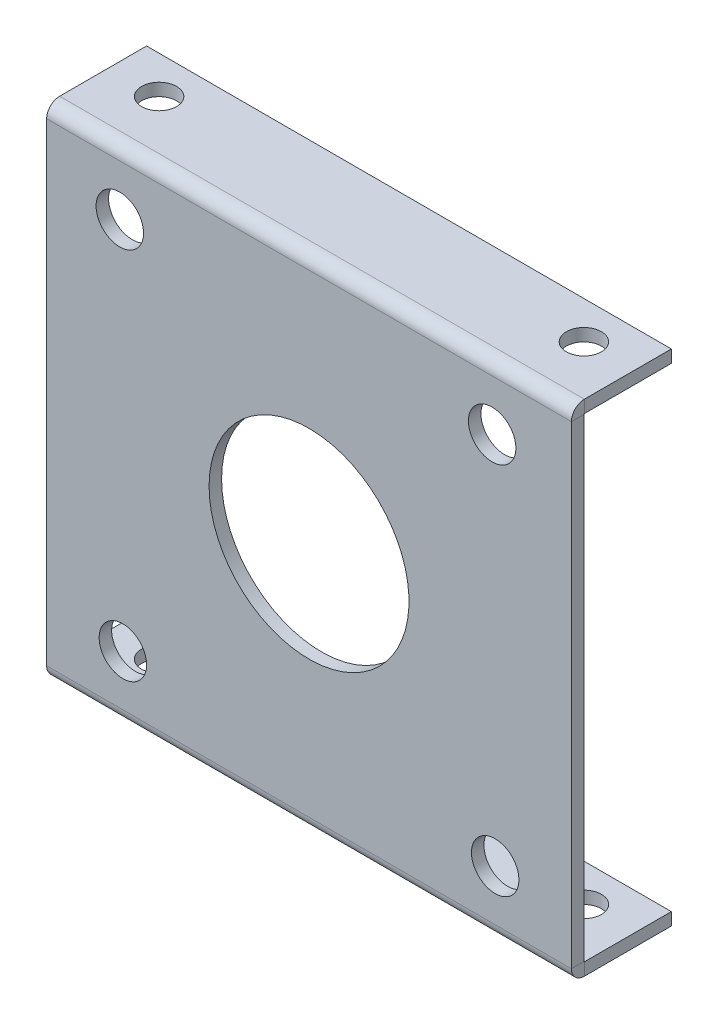
ISO-10303-21;
HEADER;
FILE_DESCRIPTION(('STEP AP214'),'2;1');
FILE_NAME('part.step','',(''),(''),'','','');
FILE_SCHEMA(('AUTOMOTIVE_DESIGN { 1 0 10303 214 1 1 1 1 }'));
ENDSEC;
DATA;
#1=APPLICATION_CONTEXT('core data for automotive mechanical design processes');
#2=APPLICATION_PROTOCOL_DEFINITION('international standard','automotive_design',2000,#1);
#3=PRODUCT_CONTEXT('',#1,'mechanical');
#4=PRODUCT('Part','Part','',(#3));
#5=PRODUCT_RELATED_PRODUCT_CATEGORY('part','',(#4));
#6=PRODUCT_DEFINITION_FORMATION('','',#4);
#7=PRODUCT_DEFINITION_CONTEXT('part definition',#1,'design');
#8=PRODUCT_DEFINITION('design','',#6,#7);
#9=PRODUCT_DEFINITION_SHAPE('','',#8);
#10=(LENGTH_UNIT() NAMED_UNIT(*) SI_UNIT(.MILLI.,.METRE.));
#11=(NAMED_UNIT(*) PLANE_ANGLE_UNIT() SI_UNIT($,.RADIAN.));
#12=(NAMED_UNIT(*) SI_UNIT($,.STERADIAN.) SOLID_ANGLE_UNIT());
#13=UNCERTAINTY_MEASURE_WITH_UNIT(LENGTH_MEASURE(1.E-05),#10,'distance_accuracy_value','');
#14=(GEOMETRIC_REPRESENTATION_CONTEXT(3) GLOBAL_UNCERTAINTY_ASSIGNED_CONTEXT((#13)) GLOBAL_UNIT_ASSIGNED_CONTEXT((#10,
#11,#12)) REPRESENTATION_CONTEXT('',''));
#15=CARTESIAN_POINT('',(0.,0.,0.));
#16=DIRECTION('',(0.,0.,1.));
#17=DIRECTION('',(1.,0.,0.));
#18=AXIS2_PLACEMENT_3D('',#15,#16,#17);
#19=CARTESIAN_POINT('',(0.,0.,-5.));
#20=DIRECTION('',(0.,0.,-1.));
#21=DIRECTION('',(-1.,0.,0.));
#22=AXIS2_PLACEMENT_3D('',#19,#20,#21);
#23=PLANE('',#22);
#24=CARTESIAN_POINT('',(74.5,-74.5,-5.));
#25=DIRECTION('',(0.,0.,-1.));
#26=DIRECTION('',(-1.,0.,0.));
#27=AXIS2_PLACEMENT_3D('',#24,#25,#26);
#28=CIRCLE('',#27,9.49999999999999);
#29=CARTESIAN_POINT('',(65.,-74.5,-5.));
#30=VERTEX_POINT('',#29);
#31=EDGE_CURVE('E297',#30,#30,#28,.T.);
#32=ORIENTED_EDGE('',*,*,#31,.F.);
#33=EDGE_LOOP('',(#32));
#34=FACE_BOUND('',#33,.T.);
#35=CARTESIAN_POINT('',(-74.5,-74.5,-5.));
#36=DIRECTION('',(0.,0.,-1.));
#37=DIRECTION('',(-1.,0.,0.));
#38=AXIS2_PLACEMENT_3D('',#35,#36,#37);
#39=CIRCLE('',#38,9.49999999999999);
#40=CARTESIAN_POINT('',(-84.,-74.5,-5.));
#41=VERTEX_POINT('',#40);
#42=EDGE_CURVE('E310',#41,#41,#39,.T.);
#43=ORIENTED_EDGE('',*,*,#42,.F.);
#44=EDGE_LOOP('',(#43));
#45=FACE_BOUND('',#44,.T.);
#46=CARTESIAN_POINT('',(-75.7170134817148,74.4950297096696,-5.));
#47=DIRECTION('',(0.,0.,-1.));
#48=DIRECTION('',(-1.,0.,0.));
#49=AXIS2_PLACEMENT_3D('',#46,#47,#48);
#50=CIRCLE('',#49,9.49999999999999);
#51=CARTESIAN_POINT('',(-85.2170134817148,74.4950297096696,-5.));
#52=VERTEX_POINT('',#51);
#53=EDGE_CURVE('E306',#52,#52,#50,.T.);
#54=ORIENTED_EDGE('',*,*,#53,.F.);
#55=EDGE_LOOP('',(#54));
#56=FACE_BOUND('',#55,.T.);
#57=CARTESIAN_POINT('',(73.2829865182852,74.4950297096696,-5.));
#58=DIRECTION('',(0.,0.,-1.));
#59=DIRECTION('',(-1.,0.,0.));
#60=AXIS2_PLACEMENT_3D('',#57,#58,#59);
#61=CIRCLE('',#60,9.49999999999999);
#62=CARTESIAN_POINT('',(63.7829865182852,74.4950297096696,-5.));
#63=VERTEX_POINT('',#62);
#64=EDGE_CURVE('E301',#63,#63,#61,.T.);
#65=ORIENTED_EDGE('',*,*,#64,.F.);
#66=EDGE_LOOP('',(#65));
#67=FACE_BOUND('',#66,.T.);
#68=CARTESIAN_POINT('',(0.,0.,-5.));
#69=DIRECTION('',(0.,0.,-1.));
#70=DIRECTION('',(-1.,0.,0.));
#71=AXIS2_PLACEMENT_3D('',#68,#69,#70);
#72=CIRCLE('',#71,40.);
#73=CARTESIAN_POINT('',(-40.,0.,-5.));
#74=VERTEX_POINT('',#73);
#75=EDGE_CURVE('E213',#74,#74,#72,.T.);
#76=ORIENTED_EDGE('',*,*,#75,.F.);
#77=EDGE_LOOP('',(#76));
#78=FACE_BOUND('',#77,.T.);
#79=DIRECTION('',(0.,1.,0.));
#80=VECTOR('',#79,1.);
#81=CARTESIAN_POINT('',(105.,-100.,-5.));
#82=LINE('',#81,#80);
#83=CARTESIAN_POINT('',(105.,-94.8,-5.00000000000001));
#84=VERTEX_POINT('',#83);
#85=CARTESIAN_POINT('',(105.,94.8,-5.));
#86=VERTEX_POINT('',#85);
#87=EDGE_CURVE('E88',#84,#86,#82,.T.);
#88=ORIENTED_EDGE('',*,*,#87,.F.);
#89=DIRECTION('',(-1.,0.,0.));
#90=VECTOR('',#89,1.);
#91=CARTESIAN_POINT('',(-105.,-94.8,-5.00000000000001));
#92=LINE('',#91,#90);
#93=CARTESIAN_POINT('',(-105.,-94.8,-5.00000000000001));
#94=VERTEX_POINT('',#93);
#95=EDGE_CURVE('E226',#94,#84,#92,.F.);
#96=ORIENTED_EDGE('',*,*,#95,.F.);
#97=DIRECTION('',(0.,-1.,0.));
#98=VECTOR('',#97,1.);
#99=CARTESIAN_POINT('',(-105.,-100.,-5.));
#100=LINE('',#99,#98);
#101=CARTESIAN_POINT('',(-105.,94.8,-5.));
#102=VERTEX_POINT('',#101);
#103=EDGE_CURVE('E13',#102,#94,#100,.T.);
#104=ORIENTED_EDGE('',*,*,#103,.F.);
#105=DIRECTION('',(1.,0.,0.));
#106=VECTOR('',#105,1.);
#107=CARTESIAN_POINT('',(105.,94.8,-5.00000000000001));
#108=LINE('',#107,#106);
#109=EDGE_CURVE('E282',#86,#102,#108,.F.);
#110=ORIENTED_EDGE('',*,*,#109,.F.);
#111=EDGE_LOOP('',(#88,#96,#104,#110));
#112=FACE_BOUND('',#111,.T.);
#113=ADVANCED_FACE('F79',(#34,#45,#56,#67,#78,#112),#23,.T.);
#114=CARTESIAN_POINT('',(0.,0.,0.));
#115=DIRECTION('',(0.,0.,-1.));
#116=DIRECTION('',(-1.,0.,0.));
#117=AXIS2_PLACEMENT_3D('',#114,#115,#116);
#118=PLANE('',#117);
#119=CARTESIAN_POINT('',(74.5,-74.5,0.));
#120=DIRECTION('',(0.,0.,-1.));
#121=DIRECTION('',(-1.,0.,0.));
#122=AXIS2_PLACEMENT_3D('',#119,#120,#121);
#123=CIRCLE('',#122,9.49999999999999);
#124=CARTESIAN_POINT('',(65.,-74.5,0.));
#125=VERTEX_POINT('',#124);
#126=EDGE_CURVE('E311',#125,#125,#123,.T.);
#127=ORIENTED_EDGE('',*,*,#126,.T.);
#128=EDGE_LOOP('',(#127));
#129=FACE_BOUND('',#128,.T.);
#130=CARTESIAN_POINT('',(-74.5,-74.5,0.));
#131=DIRECTION('',(0.,0.,-1.));
#132=DIRECTION('',(-1.,0.,0.));
#133=AXIS2_PLACEMENT_3D('',#130,#131,#132);
#134=CIRCLE('',#133,9.49999999999999);
#135=CARTESIAN_POINT('',(-84.,-74.5,0.));
#136=VERTEX_POINT('',#135);
#137=EDGE_CURVE('E307',#136,#136,#134,.T.);
#138=ORIENTED_EDGE('',*,*,#137,.T.);
#139=EDGE_LOOP('',(#138));
#140=FACE_BOUND('',#139,.T.);
#141=CARTESIAN_POINT('',(-75.7170134817148,74.4950297096696,0.));
#142=DIRECTION('',(0.,0.,-1.));
#143=DIRECTION('',(-1.,0.,0.));
#144=AXIS2_PLACEMENT_3D('',#141,#142,#143);
#145=CIRCLE('',#144,9.49999999999999);
#146=CARTESIAN_POINT('',(-85.2170134817148,74.4950297096696,0.));
#147=VERTEX_POINT('',#146);
#148=EDGE_CURVE('E303',#147,#147,#145,.T.);
#149=ORIENTED_EDGE('',*,*,#148,.T.);
#150=EDGE_LOOP('',(#149));
#151=FACE_BOUND('',#150,.T.);
#152=CARTESIAN_POINT('',(73.2829865182852,74.4950297096696,0.));
#153=DIRECTION('',(0.,0.,-1.));
#154=DIRECTION('',(-1.,0.,0.));
#155=AXIS2_PLACEMENT_3D('',#152,#153,#154);
#156=CIRCLE('',#155,9.49999999999999);
#157=CARTESIAN_POINT('',(63.7829865182852,74.4950297096696,0.));
#158=VERTEX_POINT('',#157);
#159=EDGE_CURVE('E298',#158,#158,#156,.T.);
#160=ORIENTED_EDGE('',*,*,#159,.T.);
#161=EDGE_LOOP('',(#160));
#162=FACE_BOUND('',#161,.T.);
#163=CARTESIAN_POINT('',(0.,0.,0.));
#164=DIRECTION('',(0.,0.,-1.));
#165=DIRECTION('',(-1.,0.,0.));
#166=AXIS2_PLACEMENT_3D('',#163,#164,#165);
#167=CIRCLE('',#166,40.);
#168=CARTESIAN_POINT('',(-40.,0.,0.));
#169=VERTEX_POINT('',#168);
#170=EDGE_CURVE('E294',#169,#169,#167,.T.);
#171=ORIENTED_EDGE('',*,*,#170,.T.);
#172=EDGE_LOOP('',(#171));
#173=FACE_BOUND('',#172,.T.);
#174=DIRECTION('',(-1.,0.,0.));
#175=VECTOR('',#174,1.);
#176=CARTESIAN_POINT('',(-105.,-94.8,0.));
#177=LINE('',#176,#175);
#178=CARTESIAN_POINT('',(-105.,-94.8,0.));
#179=VERTEX_POINT('',#178);
#180=CARTESIAN_POINT('',(105.,-94.8,0.));
#181=VERTEX_POINT('',#180);
#182=EDGE_CURVE('E214',#179,#181,#177,.F.);
#183=ORIENTED_EDGE('',*,*,#182,.T.);
#184=DIRECTION('',(0.,1.,0.));
#185=VECTOR('',#184,1.);
#186=CARTESIAN_POINT('',(105.,-100.,0.));
#187=LINE('',#186,#185);
#188=CARTESIAN_POINT('',(105.,94.8,0.));
#189=VERTEX_POINT('',#188);
#190=EDGE_CURVE('E288',#181,#189,#187,.T.);
#191=ORIENTED_EDGE('',*,*,#190,.T.);
#192=DIRECTION('',(1.,0.,0.));
#193=VECTOR('',#192,1.);
#194=CARTESIAN_POINT('',(105.,94.8,0.));
#195=LINE('',#194,#193);
#196=CARTESIAN_POINT('',(-105.,94.8,0.));
#197=VERTEX_POINT('',#196);
#198=EDGE_CURVE('E270',#189,#197,#195,.F.);
#199=ORIENTED_EDGE('',*,*,#198,.T.);
#200=DIRECTION('',(0.,-1.,0.));
#201=VECTOR('',#200,1.);
#202=CARTESIAN_POINT('',(-105.,-100.,0.));
#203=LINE('',#202,#201);
#204=EDGE_CURVE('E290',#197,#179,#203,.T.);
#205=ORIENTED_EDGE('',*,*,#204,.T.);
#206=EDGE_LOOP('',(#183,#191,#199,#205));
#207=FACE_BOUND('',#206,.T.);
#208=ADVANCED_FACE('F372',(#129,#140,#151,#162,#173,#207),#118,.F.);
#209=CARTESIAN_POINT('',(-105.,-100.,-5.));
#210=DIRECTION('',(-1.,0.,0.));
#211=DIRECTION('',(0.,0.,1.));
#212=AXIS2_PLACEMENT_3D('',#209,#210,#211);
#213=PLANE('',#212);
#214=ORIENTED_EDGE('',*,*,#103,.T.);
#215=DIRECTION('',(0.,0.,1.));
#216=VECTOR('',#215,1.);
#217=CARTESIAN_POINT('',(-105.,-94.8,-5.00000000000001));
#218=LINE('',#217,#216);
#219=EDGE_CURVE('E220',#94,#179,#218,.T.);
#220=ORIENTED_EDGE('',*,*,#219,.T.);
#221=ORIENTED_EDGE('',*,*,#204,.F.);
#222=DIRECTION('',(0.,0.,1.));
#223=VECTOR('',#222,1.);
#224=CARTESIAN_POINT('',(-105.,94.8,-5.00000000000001));
#225=LINE('',#224,#223);
#226=EDGE_CURVE('E95',#102,#197,#225,.T.);
#227=ORIENTED_EDGE('',*,*,#226,.F.);
#228=EDGE_LOOP('',(#214,#220,#221,#227));
#229=FACE_BOUND('',#228,.T.);
#230=ADVANCED_FACE('F378',(#229),#213,.T.);
#231=CARTESIAN_POINT('',(105.,-100.,-5.));
#232=DIRECTION('',(1.,0.,0.));
#233=DIRECTION('',(0.,0.,-1.));
#234=AXIS2_PLACEMENT_3D('',#231,#232,#233);
#235=PLANE('',#234);
#236=DIRECTION('',(0.,0.,1.));
#237=VECTOR('',#236,1.);
#238=CARTESIAN_POINT('',(105.,-94.8,-5.00000000000001));
#239=LINE('',#238,#237);
#240=EDGE_CURVE('E232',#84,#181,#239,.T.);
#241=ORIENTED_EDGE('',*,*,#240,.F.);
#242=ORIENTED_EDGE('',*,*,#87,.T.);
#243=DIRECTION('',(0.,0.,1.));
#244=VECTOR('',#243,1.);
#245=CARTESIAN_POINT('',(105.,94.8,-5.00000000000001));
#246=LINE('',#245,#244);
#247=EDGE_CURVE('E276',#86,#189,#246,.T.);
#248=ORIENTED_EDGE('',*,*,#247,.T.);
#249=ORIENTED_EDGE('',*,*,#190,.F.);
#250=EDGE_LOOP('',(#241,#242,#248,#249));
#251=FACE_BOUND('',#250,.T.);
#252=ADVANCED_FACE('F81',(#251),#235,.T.);
#253=CARTESIAN_POINT('',(-105.,94.8,-5.20000000000001));
#254=DIRECTION('',(-1.,0.,0.));
#255=DIRECTION('',(0.,0.,1.));
#256=AXIS2_PLACEMENT_3D('',#253,#254,#255);
#257=PLANE('',#256);
#258=DIRECTION('',(0.,1.,0.));
#259=VECTOR('',#258,1.);
#260=CARTESIAN_POINT('',(-105.,100.,-5.19999999999999));
#261=LINE('',#260,#259);
#262=CARTESIAN_POINT('',(-105.,95.,-5.20000000000001));
#263=VERTEX_POINT('',#262);
#264=CARTESIAN_POINT('',(-105.,100.,-5.19999999999999));
#265=VERTEX_POINT('',#264);
#266=EDGE_CURVE('E235',#263,#265,#261,.T.);
#267=ORIENTED_EDGE('',*,*,#266,.F.);
#268=CARTESIAN_POINT('',(-105.,94.8,-5.20000000000001));
#269=DIRECTION('',(1.,0.,0.));
#270=DIRECTION('',(0.,0.,-1.));
#271=AXIS2_PLACEMENT_3D('',#268,#269,#270);
#272=CIRCLE('',#271,0.200000000000006);
#273=EDGE_CURVE('E279',#102,#263,#272,.F.);
#274=ORIENTED_EDGE('',*,*,#273,.F.);
#275=ORIENTED_EDGE('',*,*,#226,.T.);
#276=CARTESIAN_POINT('',(-105.,94.8,-5.20000000000001));
#277=DIRECTION('',(1.,0.,0.));
#278=DIRECTION('',(0.,0.,-1.));
#279=AXIS2_PLACEMENT_3D('',#276,#277,#278);
#280=CIRCLE('',#279,5.20000000000001);
#281=EDGE_CURVE('E272',#197,#265,#280,.F.);
#282=ORIENTED_EDGE('',*,*,#281,.T.);
#283=EDGE_LOOP('',(#267,#274,#275,#282));
#284=FACE_BOUND('',#283,.T.);
#285=ADVANCED_FACE('F390',(#284),#257,.T.);
#286=CARTESIAN_POINT('',(105.,94.8,-5.20000000000001));
#287=DIRECTION('',(-1.,0.,0.));
#288=DIRECTION('',(0.,0.,1.));
#289=AXIS2_PLACEMENT_3D('',#286,#287,#288);
#290=PLANE('',#289);
#291=CARTESIAN_POINT('',(105.,94.8,-5.20000000000001));
#292=DIRECTION('',(1.,0.,0.));
#293=DIRECTION('',(0.,0.,-1.));
#294=AXIS2_PLACEMENT_3D('',#291,#292,#293);
#295=CIRCLE('',#294,0.200000000000006);
#296=CARTESIAN_POINT('',(105.,95.,-5.20000000000001));
#297=VERTEX_POINT('',#296);
#298=EDGE_CURVE('E240',#297,#86,#295,.T.);
#299=ORIENTED_EDGE('',*,*,#298,.F.);
#300=DIRECTION('',(0.,1.,0.));
#301=VECTOR('',#300,1.);
#302=CARTESIAN_POINT('',(105.,95.,-5.20000000000001));
#303=LINE('',#302,#301);
#304=CARTESIAN_POINT('',(105.,100.,-5.19999999999999));
#305=VERTEX_POINT('',#304);
#306=EDGE_CURVE('E263',#297,#305,#303,.T.);
#307=ORIENTED_EDGE('',*,*,#306,.T.);
#308=CARTESIAN_POINT('',(105.,94.8,-5.20000000000001));
#309=DIRECTION('',(1.,0.,0.));
#310=DIRECTION('',(0.,0.,-1.));
#311=AXIS2_PLACEMENT_3D('',#308,#309,#310);
#312=CIRCLE('',#311,5.20000000000001);
#313=EDGE_CURVE('E273',#305,#189,#312,.T.);
#314=ORIENTED_EDGE('',*,*,#313,.T.);
#315=ORIENTED_EDGE('',*,*,#247,.F.);
#316=EDGE_LOOP('',(#299,#307,#314,#315));
#317=FACE_BOUND('',#316,.T.);
#318=ADVANCED_FACE('F384',(#317),#290,.F.);
#319=CARTESIAN_POINT('',(105.,94.8,-5.20000000000001));
#320=DIRECTION('',(1.,0.,0.));
#321=DIRECTION('',(0.,1.,0.));
#322=AXIS2_PLACEMENT_3D('',#319,#320,#321);
#323=CYLINDRICAL_SURFACE('',#322,5.20000000000001);
#324=ORIENTED_EDGE('',*,*,#198,.F.);
#325=ORIENTED_EDGE('',*,*,#313,.F.);
#326=DIRECTION('',(1.,0.,0.));
#327=VECTOR('',#326,1.);
#328=CARTESIAN_POINT('',(0.,100.,-5.19999999999999));
#329=LINE('',#328,#327);
#330=EDGE_CURVE('E260',#265,#305,#329,.T.);
#331=ORIENTED_EDGE('',*,*,#330,.F.);
#332=ORIENTED_EDGE('',*,*,#281,.F.);
#333=EDGE_LOOP('',(#324,#325,#331,#332));
#334=FACE_BOUND('',#333,.T.);
#335=ADVANCED_FACE('F423',(#334),#323,.T.);
#336=CARTESIAN_POINT('',(105.,94.8,-5.20000000000001));
#337=DIRECTION('',(1.,0.,0.));
#338=DIRECTION('',(0.,1.,0.));
#339=AXIS2_PLACEMENT_3D('',#336,#337,#338);
#340=CYLINDRICAL_SURFACE('',#339,0.200000000000006);
#341=ORIENTED_EDGE('',*,*,#109,.T.);
#342=ORIENTED_EDGE('',*,*,#273,.T.);
#343=DIRECTION('',(-1.,0.,0.));
#344=VECTOR('',#343,1.);
#345=CARTESIAN_POINT('',(-105.,95.,-5.20000000000001));
#346=LINE('',#345,#344);
#347=EDGE_CURVE('E266',#263,#297,#346,.F.);
#348=ORIENTED_EDGE('',*,*,#347,.T.);
#349=ORIENTED_EDGE('',*,*,#298,.T.);
#350=EDGE_LOOP('',(#341,#342,#348,#349));
#351=FACE_BOUND('',#350,.T.);
#352=ADVANCED_FACE('F396',(#351),#340,.F.);
#353=CARTESIAN_POINT('',(105.,100.,-4.99999999999998));
#354=DIRECTION('',(1.,0.,0.));
#355=DIRECTION('',(0.,0.,-1.));
#356=AXIS2_PLACEMENT_3D('',#353,#354,#355);
#357=PLANE('',#356);
#358=DIRECTION('',(0.,0.,1.));
#359=VECTOR('',#358,1.);
#360=CARTESIAN_POINT('',(105.,100.,-4.99999999999998));
#361=LINE('',#360,#359);
#362=CARTESIAN_POINT('',(105.,100.,-40.));
#363=VERTEX_POINT('',#362);
#364=EDGE_CURVE('E244',#363,#305,#361,.T.);
#365=ORIENTED_EDGE('',*,*,#364,.T.);
#366=ORIENTED_EDGE('',*,*,#306,.F.);
#367=DIRECTION('',(0.,0.,-1.));
#368=VECTOR('',#367,1.);
#369=CARTESIAN_POINT('',(105.,95.,3.56857400772372E-13));
#370=LINE('',#369,#368);
#371=CARTESIAN_POINT('',(105.,95.0000000000001,-40.));
#372=VERTEX_POINT('',#371);
#373=EDGE_CURVE('E252',#372,#297,#370,.F.);
#374=ORIENTED_EDGE('',*,*,#373,.F.);
#375=DIRECTION('',(0.,-1.,0.));
#376=VECTOR('',#375,1.);
#377=CARTESIAN_POINT('',(105.,100.,-40.));
#378=LINE('',#377,#376);
#379=EDGE_CURVE('E238',#363,#372,#378,.T.);
#380=ORIENTED_EDGE('',*,*,#379,.F.);
#381=EDGE_LOOP('',(#365,#366,#374,#380));
#382=FACE_BOUND('',#381,.T.);
#383=ADVANCED_FACE('F418',(#382),#357,.T.);
#384=CARTESIAN_POINT('',(-105.,100.,-40.));
#385=DIRECTION('',(-1.,0.,0.));
#386=DIRECTION('',(0.,0.,1.));
#387=AXIS2_PLACEMENT_3D('',#384,#385,#386);
#388=PLANE('',#387);
#389=DIRECTION('',(0.,0.,1.));
#390=VECTOR('',#389,1.);
#391=CARTESIAN_POINT('',(-105.,95.,3.56857400772372E-13));
#392=LINE('',#391,#390);
#393=CARTESIAN_POINT('',(-105.,95.0000000000001,-40.));
#394=VERTEX_POINT('',#393);
#395=EDGE_CURVE('E258',#263,#394,#392,.F.);
#396=ORIENTED_EDGE('',*,*,#395,.F.);
#397=ORIENTED_EDGE('',*,*,#266,.T.);
#398=DIRECTION('',(0.,0.,-1.));
#399=VECTOR('',#398,1.);
#400=CARTESIAN_POINT('',(-105.,100.,-40.));
#401=LINE('',#400,#399);
#402=CARTESIAN_POINT('',(-105.,100.,-40.));
#403=VERTEX_POINT('',#402);
#404=EDGE_CURVE('E250',#265,#403,#401,.T.);
#405=ORIENTED_EDGE('',*,*,#404,.T.);
#406=DIRECTION('',(0.,-1.,0.));
#407=VECTOR('',#406,1.);
#408=CARTESIAN_POINT('',(-105.,100.,-40.));
#409=LINE('',#408,#407);
#410=EDGE_CURVE('E241',#403,#394,#409,.T.);
#411=ORIENTED_EDGE('',*,*,#410,.T.);
#412=EDGE_LOOP('',(#396,#397,#405,#411));
#413=FACE_BOUND('',#412,.T.);
#414=ADVANCED_FACE('F404',(#413),#388,.T.);
#415=CARTESIAN_POINT('',(0.,100.,3.74314807466587E-13));
#416=DIRECTION('',(0.,1.,0.));
#417=DIRECTION('',(0.,0.,1.));
#418=AXIS2_PLACEMENT_3D('',#415,#416,#417);
#419=PLANE('',#418);
#420=CARTESIAN_POINT('',(-85.,100.,-25.0000000000007));
#421=DIRECTION('',(0.,-1.,0.));
#422=DIRECTION('',(0.,0.,-1.));
#423=AXIS2_PLACEMENT_3D('',#420,#421,#422);
#424=CIRCLE('',#423,7.);
#425=CARTESIAN_POINT('',(-85.,100.,-32.0000000000007));
#426=VERTEX_POINT('',#425);
#427=EDGE_CURVE('E316',#426,#426,#424,.T.);
#428=ORIENTED_EDGE('',*,*,#427,.T.);
#429=EDGE_LOOP('',(#428));
#430=FACE_BOUND('',#429,.T.);
#431=CARTESIAN_POINT('',(85.,100.,-25.0000000000007));
#432=DIRECTION('',(0.,-1.,0.));
#433=DIRECTION('',(0.,0.,-1.));
#434=AXIS2_PLACEMENT_3D('',#431,#432,#433);
#435=CIRCLE('',#434,7.);
#436=CARTESIAN_POINT('',(85.,100.,-32.0000000000007));
#437=VERTEX_POINT('',#436);
#438=EDGE_CURVE('E323',#437,#437,#435,.T.);
#439=ORIENTED_EDGE('',*,*,#438,.T.);
#440=EDGE_LOOP('',(#439));
#441=FACE_BOUND('',#440,.T.);
#442=ORIENTED_EDGE('',*,*,#404,.F.);
#443=ORIENTED_EDGE('',*,*,#330,.T.);
#444=ORIENTED_EDGE('',*,*,#364,.F.);
#445=DIRECTION('',(1.,0.,0.));
#446=VECTOR('',#445,1.);
#447=CARTESIAN_POINT('',(105.,100.,-40.));
#448=LINE('',#447,#446);
#449=EDGE_CURVE('E247',#403,#363,#448,.T.);
#450=ORIENTED_EDGE('',*,*,#449,.F.);
#451=EDGE_LOOP('',(#442,#443,#444,#450));
#452=FACE_BOUND('',#451,.T.);
#453=ADVANCED_FACE('F408',(#430,#441,#452),#419,.T.);
#454=CARTESIAN_POINT('',(0.,95.,3.56857400772372E-13));
#455=DIRECTION('',(0.,1.,0.));
#456=DIRECTION('',(0.,0.,1.));
#457=AXIS2_PLACEMENT_3D('',#454,#455,#456);
#458=PLANE('',#457);
#459=CARTESIAN_POINT('',(-85.,95.0000000000001,-25.0000000000007));
#460=DIRECTION('',(0.,1.,0.));
#461=DIRECTION('',(0.,0.,1.));
#462=AXIS2_PLACEMENT_3D('',#459,#460,#461);
#463=CIRCLE('',#462,7.);
#464=CARTESIAN_POINT('',(-85.,95.,-18.0000000000007));
#465=VERTEX_POINT('',#464);
#466=EDGE_CURVE('E302',#465,#465,#463,.T.);
#467=ORIENTED_EDGE('',*,*,#466,.T.);
#468=EDGE_LOOP('',(#467));
#469=FACE_BOUND('',#468,.T.);
#470=CARTESIAN_POINT('',(85.,95.0000000000001,-25.0000000000007));
#471=DIRECTION('',(0.,1.,0.));
#472=DIRECTION('',(0.,0.,1.));
#473=AXIS2_PLACEMENT_3D('',#470,#471,#472);
#474=CIRCLE('',#473,7.);
#475=CARTESIAN_POINT('',(85.,95.,-18.0000000000007));
#476=VERTEX_POINT('',#475);
#477=EDGE_CURVE('E320',#476,#476,#474,.T.);
#478=ORIENTED_EDGE('',*,*,#477,.T.);
#479=EDGE_LOOP('',(#478));
#480=FACE_BOUND('',#479,.T.);
#481=ORIENTED_EDGE('',*,*,#347,.F.);
#482=ORIENTED_EDGE('',*,*,#395,.T.);
#483=DIRECTION('',(-1.,0.,0.));
#484=VECTOR('',#483,1.);
#485=CARTESIAN_POINT('',(0.,95.0000000000001,-40.));
#486=LINE('',#485,#484);
#487=EDGE_CURVE('E255',#394,#372,#486,.F.);
#488=ORIENTED_EDGE('',*,*,#487,.T.);
#489=ORIENTED_EDGE('',*,*,#373,.T.);
#490=EDGE_LOOP('',(#481,#482,#488,#489));
#491=FACE_BOUND('',#490,.T.);
#492=ADVANCED_FACE('F415',(#469,#480,#491),#458,.F.);
#493=CARTESIAN_POINT('',(105.,100.,-40.));
#494=DIRECTION('',(0.,0.,-1.));
#495=DIRECTION('',(0.,1.,0.));
#496=AXIS2_PLACEMENT_3D('',#493,#494,#495);
#497=PLANE('',#496);
#498=ORIENTED_EDGE('',*,*,#487,.F.);
#499=ORIENTED_EDGE('',*,*,#410,.F.);
#500=ORIENTED_EDGE('',*,*,#449,.T.);
#501=ORIENTED_EDGE('',*,*,#379,.T.);
#502=EDGE_LOOP('',(#498,#499,#500,#501));
#503=FACE_BOUND('',#502,.T.);
#504=ADVANCED_FACE('F412',(#503),#497,.T.);
#505=CARTESIAN_POINT('',(105.,-94.8,-5.20000000000001));
#506=DIRECTION('',(1.,0.,0.));
#507=DIRECTION('',(0.,0.,-1.));
#508=AXIS2_PLACEMENT_3D('',#505,#506,#507);
#509=PLANE('',#508);
#510=DIRECTION('',(0.,1.,0.));
#511=VECTOR('',#510,1.);
#512=CARTESIAN_POINT('',(105.,-100.,-5.19999999999999));
#513=LINE('',#512,#511);
#514=CARTESIAN_POINT('',(105.,-95.,-5.20000000000001));
#515=VERTEX_POINT('',#514);
#516=CARTESIAN_POINT('',(105.,-100.,-5.19999999999999));
#517=VERTEX_POINT('',#516);
#518=EDGE_CURVE('E195',#515,#517,#513,.F.);
#519=ORIENTED_EDGE('',*,*,#518,.F.);
#520=CARTESIAN_POINT('',(105.,-94.8,-5.20000000000001));
#521=DIRECTION('',(-1.,0.,0.));
#522=DIRECTION('',(0.,0.,1.));
#523=AXIS2_PLACEMENT_3D('',#520,#521,#522);
#524=CIRCLE('',#523,0.200000000000006);
#525=EDGE_CURVE('E223',#84,#515,#524,.F.);
#526=ORIENTED_EDGE('',*,*,#525,.F.);
#527=ORIENTED_EDGE('',*,*,#240,.T.);
#528=CARTESIAN_POINT('',(105.,-94.8,-5.20000000000001));
#529=DIRECTION('',(-1.,0.,0.));
#530=DIRECTION('',(0.,0.,1.));
#531=AXIS2_PLACEMENT_3D('',#528,#529,#530);
#532=CIRCLE('',#531,5.20000000000001);
#533=EDGE_CURVE('E216',#181,#517,#532,.F.);
#534=ORIENTED_EDGE('',*,*,#533,.T.);
#535=EDGE_LOOP('',(#519,#526,#527,#534));
#536=FACE_BOUND('',#535,.T.);
#537=ADVANCED_FACE('F428',(#536),#509,.T.);
#538=CARTESIAN_POINT('',(-105.,-94.8,-5.20000000000001));
#539=DIRECTION('',(1.,0.,0.));
#540=DIRECTION('',(0.,0.,-1.));
#541=AXIS2_PLACEMENT_3D('',#538,#539,#540);
#542=PLANE('',#541);
#543=CARTESIAN_POINT('',(-105.,-94.8,-5.20000000000001));
#544=DIRECTION('',(-1.,0.,0.));
#545=DIRECTION('',(0.,0.,1.));
#546=AXIS2_PLACEMENT_3D('',#543,#544,#545);
#547=CIRCLE('',#546,0.200000000000006);
#548=CARTESIAN_POINT('',(-105.,-95.,-5.20000000000001));
#549=VERTEX_POINT('',#548);
#550=EDGE_CURVE('E229',#549,#94,#547,.T.);
#551=ORIENTED_EDGE('',*,*,#550,.F.);
#552=DIRECTION('',(0.,1.,0.));
#553=VECTOR('',#552,1.);
#554=CARTESIAN_POINT('',(-105.,-95.,-5.20000000000001));
#555=LINE('',#554,#553);
#556=CARTESIAN_POINT('',(-105.,-100.,-5.19999999999999));
#557=VERTEX_POINT('',#556);
#558=EDGE_CURVE('E207',#549,#557,#555,.F.);
#559=ORIENTED_EDGE('',*,*,#558,.T.);
#560=CARTESIAN_POINT('',(-105.,-94.8,-5.20000000000001));
#561=DIRECTION('',(-1.,0.,0.));
#562=DIRECTION('',(0.,0.,1.));
#563=AXIS2_PLACEMENT_3D('',#560,#561,#562);
#564=CIRCLE('',#563,5.20000000000001);
#565=EDGE_CURVE('E217',#557,#179,#564,.T.);
#566=ORIENTED_EDGE('',*,*,#565,.T.);
#567=ORIENTED_EDGE('',*,*,#219,.F.);
#568=EDGE_LOOP('',(#551,#559,#566,#567));
#569=FACE_BOUND('',#568,.T.);
#570=ADVANCED_FACE('F358',(#569),#542,.F.);
#571=CARTESIAN_POINT('',(-105.,-94.8,-5.20000000000001));
#572=DIRECTION('',(-1.,0.,0.));
#573=DIRECTION('',(0.,-1.,0.));
#574=AXIS2_PLACEMENT_3D('',#571,#572,#573);
#575=CYLINDRICAL_SURFACE('',#574,5.20000000000001);
#576=ORIENTED_EDGE('',*,*,#182,.F.);
#577=ORIENTED_EDGE('',*,*,#565,.F.);
#578=DIRECTION('',(-1.,0.,0.));
#579=VECTOR('',#578,1.);
#580=CARTESIAN_POINT('',(105.,-100.,-5.19999999999999));
#581=LINE('',#580,#579);
#582=EDGE_CURVE('E205',#557,#517,#581,.F.);
#583=ORIENTED_EDGE('',*,*,#582,.T.);
#584=ORIENTED_EDGE('',*,*,#533,.F.);
#585=EDGE_LOOP('',(#576,#577,#583,#584));
#586=FACE_BOUND('',#585,.T.);
#587=ADVANCED_FACE('F367',(#586),#575,.T.);
#588=CARTESIAN_POINT('',(-105.,-94.8,-5.20000000000001));
#589=DIRECTION('',(-1.,0.,0.));
#590=DIRECTION('',(0.,-1.,0.));
#591=AXIS2_PLACEMENT_3D('',#588,#589,#590);
#592=CYLINDRICAL_SURFACE('',#591,0.200000000000006);
#593=ORIENTED_EDGE('',*,*,#95,.T.);
#594=ORIENTED_EDGE('',*,*,#525,.T.);
#595=DIRECTION('',(-1.,0.,0.));
#596=VECTOR('',#595,1.);
#597=CARTESIAN_POINT('',(105.,-95.,-5.20000000000001));
#598=LINE('',#597,#596);
#599=EDGE_CURVE('E210',#515,#549,#598,.T.);
#600=ORIENTED_EDGE('',*,*,#599,.T.);
#601=ORIENTED_EDGE('',*,*,#550,.T.);
#602=EDGE_LOOP('',(#593,#594,#600,#601));
#603=FACE_BOUND('',#602,.T.);
#604=ADVANCED_FACE('F353',(#603),#592,.F.);
#605=CARTESIAN_POINT('',(-105.,-100.,-40.));
#606=DIRECTION('',(1.,0.,0.));
#607=DIRECTION('',(0.,0.,-1.));
#608=AXIS2_PLACEMENT_3D('',#605,#606,#607);
#609=PLANE('',#608);
#610=ORIENTED_EDGE('',*,*,#558,.F.);
#611=DIRECTION('',(0.,0.,1.));
#612=VECTOR('',#611,1.);
#613=CARTESIAN_POINT('',(-105.,-95.0000000000001,-40.));
#614=LINE('',#613,#612);
#615=CARTESIAN_POINT('',(-105.,-95.0000000000001,-40.));
#616=VERTEX_POINT('',#615);
#617=EDGE_CURVE('E203',#549,#616,#614,.F.);
#618=ORIENTED_EDGE('',*,*,#617,.T.);
#619=DIRECTION('',(0.,1.,0.));
#620=VECTOR('',#619,1.);
#621=CARTESIAN_POINT('',(-105.,-100.,-40.));
#622=LINE('',#621,#620);
#623=CARTESIAN_POINT('',(-105.,-100.,-40.));
#624=VERTEX_POINT('',#623);
#625=EDGE_CURVE('E191',#624,#616,#622,.T.);
#626=ORIENTED_EDGE('',*,*,#625,.F.);
#627=DIRECTION('',(0.,0.,-1.));
#628=VECTOR('',#627,1.);
#629=CARTESIAN_POINT('',(-105.,-100.,3.74314807466587E-13));
#630=LINE('',#629,#628);
#631=EDGE_CURVE('E178',#557,#624,#630,.T.);
#632=ORIENTED_EDGE('',*,*,#631,.F.);
#633=EDGE_LOOP('',(#610,#618,#626,#632));
#634=FACE_BOUND('',#633,.T.);
#635=ADVANCED_FACE('F359',(#634),#609,.F.);
#636=CARTESIAN_POINT('',(105.,-100.,-4.99999999999998));
#637=DIRECTION('',(-1.,0.,0.));
#638=DIRECTION('',(0.,0.,1.));
#639=AXIS2_PLACEMENT_3D('',#636,#637,#638);
#640=PLANE('',#639);
#641=ORIENTED_EDGE('',*,*,#518,.T.);
#642=DIRECTION('',(0.,0.,1.));
#643=VECTOR('',#642,1.);
#644=CARTESIAN_POINT('',(105.,-100.,3.74314807466587E-13));
#645=LINE('',#644,#643);
#646=CARTESIAN_POINT('',(105.,-100.,-40.));
#647=VERTEX_POINT('',#646);
#648=EDGE_CURVE('E176',#647,#517,#645,.T.);
#649=ORIENTED_EDGE('',*,*,#648,.F.);
#650=DIRECTION('',(0.,1.,0.));
#651=VECTOR('',#650,1.);
#652=CARTESIAN_POINT('',(105.,-100.,-40.));
#653=LINE('',#652,#651);
#654=CARTESIAN_POINT('',(105.,-95.0000000000001,-40.));
#655=VERTEX_POINT('',#654);
#656=EDGE_CURVE('E184',#647,#655,#653,.T.);
#657=ORIENTED_EDGE('',*,*,#656,.T.);
#658=DIRECTION('',(0.,0.,-1.));
#659=VECTOR('',#658,1.);
#660=CARTESIAN_POINT('',(105.,-95.,-5.));
#661=LINE('',#660,#659);
#662=EDGE_CURVE('E200',#655,#515,#661,.F.);
#663=ORIENTED_EDGE('',*,*,#662,.T.);
#664=EDGE_LOOP('',(#641,#649,#657,#663));
#665=FACE_BOUND('',#664,.T.);
#666=ADVANCED_FACE('F194',(#665),#640,.F.);
#667=CARTESIAN_POINT('',(0.,-100.,3.74314807466587E-13));
#668=DIRECTION('',(0.,1.,0.));
#669=DIRECTION('',(0.,0.,1.));
#670=AXIS2_PLACEMENT_3D('',#667,#668,#669);
#671=PLANE('',#670);
#672=CARTESIAN_POINT('',(-85.,-100.,-25.));
#673=DIRECTION('',(0.,1.,0.));
#674=DIRECTION('',(0.,0.,1.));
#675=AXIS2_PLACEMENT_3D('',#672,#673,#674);
#676=CIRCLE('',#675,7.);
#677=CARTESIAN_POINT('',(-85.,-100.,-18.));
#678=VERTEX_POINT('',#677);
#679=EDGE_CURVE('E332',#678,#678,#676,.T.);
#680=ORIENTED_EDGE('',*,*,#679,.T.);
#681=EDGE_LOOP('',(#680));
#682=FACE_BOUND('',#681,.T.);
#683=CARTESIAN_POINT('',(85.,-100.,-25.));
#684=DIRECTION('',(0.,1.,0.));
#685=DIRECTION('',(0.,0.,1.));
#686=AXIS2_PLACEMENT_3D('',#683,#684,#685);
#687=CIRCLE('',#686,7.);
#688=CARTESIAN_POINT('',(85.,-100.,-18.));
#689=VERTEX_POINT('',#688);
#690=EDGE_CURVE('E315',#689,#689,#687,.T.);
#691=ORIENTED_EDGE('',*,*,#690,.T.);
#692=EDGE_LOOP('',(#691));
#693=FACE_BOUND('',#692,.T.);
#694=ORIENTED_EDGE('',*,*,#582,.F.);
#695=ORIENTED_EDGE('',*,*,#631,.T.);
#696=DIRECTION('',(1.,0.,0.));
#697=VECTOR('',#696,1.);
#698=CARTESIAN_POINT('',(0.,-100.,-40.));
#699=LINE('',#698,#697);
#700=EDGE_CURVE('E171',#624,#647,#699,.T.);
#701=ORIENTED_EDGE('',*,*,#700,.T.);
#702=ORIENTED_EDGE('',*,*,#648,.T.);
#703=EDGE_LOOP('',(#694,#695,#701,#702));
#704=FACE_BOUND('',#703,.T.);
#705=ADVANCED_FACE('F174',(#682,#693,#704),#671,.F.);
#706=CARTESIAN_POINT('',(0.,-95.,3.56857400772372E-13));
#707=DIRECTION('',(0.,1.,0.));
#708=DIRECTION('',(0.,0.,1.));
#709=AXIS2_PLACEMENT_3D('',#706,#707,#708);
#710=PLANE('',#709);
#711=CARTESIAN_POINT('',(-85.,-95.0000000000001,-25.));
#712=DIRECTION('',(0.,1.,0.));
#713=DIRECTION('',(0.,0.,1.));
#714=AXIS2_PLACEMENT_3D('',#711,#712,#713);
#715=CIRCLE('',#714,7.);
#716=CARTESIAN_POINT('',(-85.,-95.,-18.));
#717=VERTEX_POINT('',#716);
#718=EDGE_CURVE('E83',#717,#717,#715,.T.);
#719=ORIENTED_EDGE('',*,*,#718,.F.);
#720=EDGE_LOOP('',(#719));
#721=FACE_BOUND('',#720,.T.);
#722=CARTESIAN_POINT('',(85.,-95.0000000000001,-25.));
#723=DIRECTION('',(0.,1.,0.));
#724=DIRECTION('',(0.,0.,1.));
#725=AXIS2_PLACEMENT_3D('',#722,#723,#724);
#726=CIRCLE('',#725,7.);
#727=CARTESIAN_POINT('',(85.,-95.,-18.));
#728=VERTEX_POINT('',#727);
#729=EDGE_CURVE('E313',#728,#728,#726,.T.);
#730=ORIENTED_EDGE('',*,*,#729,.F.);
#731=EDGE_LOOP('',(#730));
#732=FACE_BOUND('',#731,.T.);
#733=ORIENTED_EDGE('',*,*,#617,.F.);
#734=ORIENTED_EDGE('',*,*,#599,.F.);
#735=ORIENTED_EDGE('',*,*,#662,.F.);
#736=DIRECTION('',(-1.,0.,0.));
#737=VECTOR('',#736,1.);
#738=CARTESIAN_POINT('',(105.,-95.0000000000001,-40.));
#739=LINE('',#738,#737);
#740=EDGE_CURVE('E187',#616,#655,#739,.F.);
#741=ORIENTED_EDGE('',*,*,#740,.F.);
#742=EDGE_LOOP('',(#733,#734,#735,#741));
#743=FACE_BOUND('',#742,.T.);
#744=ADVANCED_FACE('F349',(#721,#732,#743),#710,.T.);
#745=CARTESIAN_POINT('',(105.,-100.,-40.));
#746=DIRECTION('',(0.,0.,1.));
#747=DIRECTION('',(0.,-1.,0.));
#748=AXIS2_PLACEMENT_3D('',#745,#746,#747);
#749=PLANE('',#748);
#750=ORIENTED_EDGE('',*,*,#740,.T.);
#751=ORIENTED_EDGE('',*,*,#656,.F.);
#752=ORIENTED_EDGE('',*,*,#700,.F.);
#753=ORIENTED_EDGE('',*,*,#625,.T.);
#754=EDGE_LOOP('',(#750,#751,#752,#753));
#755=FACE_BOUND('',#754,.T.);
#756=ADVANCED_FACE('F185',(#755),#749,.F.);
#757=CARTESIAN_POINT('',(0.,0.,-40.));
#758=DIRECTION('',(0.,0.,1.));
#759=DIRECTION('',(1.,0.,0.));
#760=AXIS2_PLACEMENT_3D('',#757,#758,#759);
#761=CYLINDRICAL_SURFACE('',#760,40.);
#762=ORIENTED_EDGE('',*,*,#75,.T.);
#763=EDGE_LOOP('',(#762));
#764=FACE_BOUND('',#763,.T.);
#765=ORIENTED_EDGE('',*,*,#170,.F.);
#766=EDGE_LOOP('',(#765));
#767=FACE_BOUND('',#766,.T.);
#768=ADVANCED_FACE('F550',(#764,#767),#761,.F.);
#769=CARTESIAN_POINT('',(73.2829865182852,74.4950297096696,-40.));
#770=DIRECTION('',(0.,0.,1.));
#771=DIRECTION('',(1.,0.,0.));
#772=AXIS2_PLACEMENT_3D('',#769,#770,#771);
#773=CYLINDRICAL_SURFACE('',#772,9.49999999999999);
#774=ORIENTED_EDGE('',*,*,#64,.T.);
#775=EDGE_LOOP('',(#774));
#776=FACE_BOUND('',#775,.T.);
#777=ORIENTED_EDGE('',*,*,#159,.F.);
#778=EDGE_LOOP('',(#777));
#779=FACE_BOUND('',#778,.T.);
#780=ADVANCED_FACE('F560',(#776,#779),#773,.F.);
#781=CARTESIAN_POINT('',(-75.7170134817148,74.4950297096696,-40.));
#782=DIRECTION('',(0.,0.,1.));
#783=DIRECTION('',(1.,0.,0.));
#784=AXIS2_PLACEMENT_3D('',#781,#782,#783);
#785=CYLINDRICAL_SURFACE('',#784,9.49999999999999);
#786=ORIENTED_EDGE('',*,*,#53,.T.);
#787=EDGE_LOOP('',(#786));
#788=FACE_BOUND('',#787,.T.);
#789=ORIENTED_EDGE('',*,*,#148,.F.);
#790=EDGE_LOOP('',(#789));
#791=FACE_BOUND('',#790,.T.);
#792=ADVANCED_FACE('F582',(#788,#791),#785,.F.);
#793=CARTESIAN_POINT('',(-74.5,-74.5,-40.));
#794=DIRECTION('',(0.,0.,1.));
#795=DIRECTION('',(1.,0.,0.));
#796=AXIS2_PLACEMENT_3D('',#793,#794,#795);
#797=CYLINDRICAL_SURFACE('',#796,9.49999999999999);
#798=ORIENTED_EDGE('',*,*,#42,.T.);
#799=EDGE_LOOP('',(#798));
#800=FACE_BOUND('',#799,.T.);
#801=ORIENTED_EDGE('',*,*,#137,.F.);
#802=EDGE_LOOP('',(#801));
#803=FACE_BOUND('',#802,.T.);
#804=ADVANCED_FACE('F593',(#800,#803),#797,.F.);
#805=CARTESIAN_POINT('',(74.5,-74.5,-40.));
#806=DIRECTION('',(0.,0.,1.));
#807=DIRECTION('',(1.,0.,0.));
#808=AXIS2_PLACEMENT_3D('',#805,#806,#807);
#809=CYLINDRICAL_SURFACE('',#808,9.49999999999999);
#810=ORIENTED_EDGE('',*,*,#31,.T.);
#811=EDGE_LOOP('',(#810));
#812=FACE_BOUND('',#811,.T.);
#813=ORIENTED_EDGE('',*,*,#126,.F.);
#814=EDGE_LOOP('',(#813));
#815=FACE_BOUND('',#814,.T.);
#816=ADVANCED_FACE('F603',(#812,#815),#809,.F.);
#817=CARTESIAN_POINT('',(85.,100.,-25.0000000000007));
#818=DIRECTION('',(0.,-1.,0.));
#819=DIRECTION('',(0.,0.,-1.));
#820=AXIS2_PLACEMENT_3D('',#817,#818,#819);
#821=CYLINDRICAL_SURFACE('',#820,7.);
#822=ORIENTED_EDGE('',*,*,#729,.T.);
#823=EDGE_LOOP('',(#822));
#824=FACE_BOUND('',#823,.T.);
#825=ORIENTED_EDGE('',*,*,#690,.F.);
#826=EDGE_LOOP('',(#825));
#827=FACE_BOUND('',#826,.T.);
#828=ADVANCED_FACE('F613',(#824,#827),#821,.F.);
#829=CARTESIAN_POINT('',(-85.,100.,-25.0000000000007));
#830=DIRECTION('',(0.,-1.,0.));
#831=DIRECTION('',(0.,0.,-1.));
#832=AXIS2_PLACEMENT_3D('',#829,#830,#831);
#833=CYLINDRICAL_SURFACE('',#832,7.);
#834=ORIENTED_EDGE('',*,*,#718,.T.);
#835=EDGE_LOOP('',(#834));
#836=FACE_BOUND('',#835,.T.);
#837=ORIENTED_EDGE('',*,*,#679,.F.);
#838=EDGE_LOOP('',(#837));
#839=FACE_BOUND('',#838,.T.);
#840=ADVANCED_FACE('F625',(#836,#839),#833,.F.);
#841=ORIENTED_EDGE('',*,*,#438,.F.);
#842=EDGE_LOOP('',(#841));
#843=FACE_BOUND('',#842,.T.);
#844=ORIENTED_EDGE('',*,*,#477,.F.);
#845=EDGE_LOOP('',(#844));
#846=FACE_BOUND('',#845,.T.);
#847=ADVANCED_FACE('F627',(#843,#846),#821,.F.);
#848=ORIENTED_EDGE('',*,*,#427,.F.);
#849=EDGE_LOOP('',(#848));
#850=FACE_BOUND('',#849,.T.);
#851=ORIENTED_EDGE('',*,*,#466,.F.);
#852=EDGE_LOOP('',(#851));
#853=FACE_BOUND('',#852,.T.);
#854=ADVANCED_FACE('F635',(#850,#853),#833,.F.);
#855=CLOSED_SHELL('',(#113,#208,#230,#252,#285,#318,#335,#352,#383,#414,#453,#492,#504,#537,
#570,#587,#604,#635,#666,#705,#744,#756,#768,#780,#792,#804,#816,#828,#840,#847,#854));
#856=MANIFOLD_SOLID_BREP('B2',#855);
#857=ADVANCED_BREP_SHAPE_REPRESENTATION('',(#18,#856),#14);
#858=SHAPE_DEFINITION_REPRESENTATION(#9,#857);
ENDSEC;
END-ISO-10303-21;
